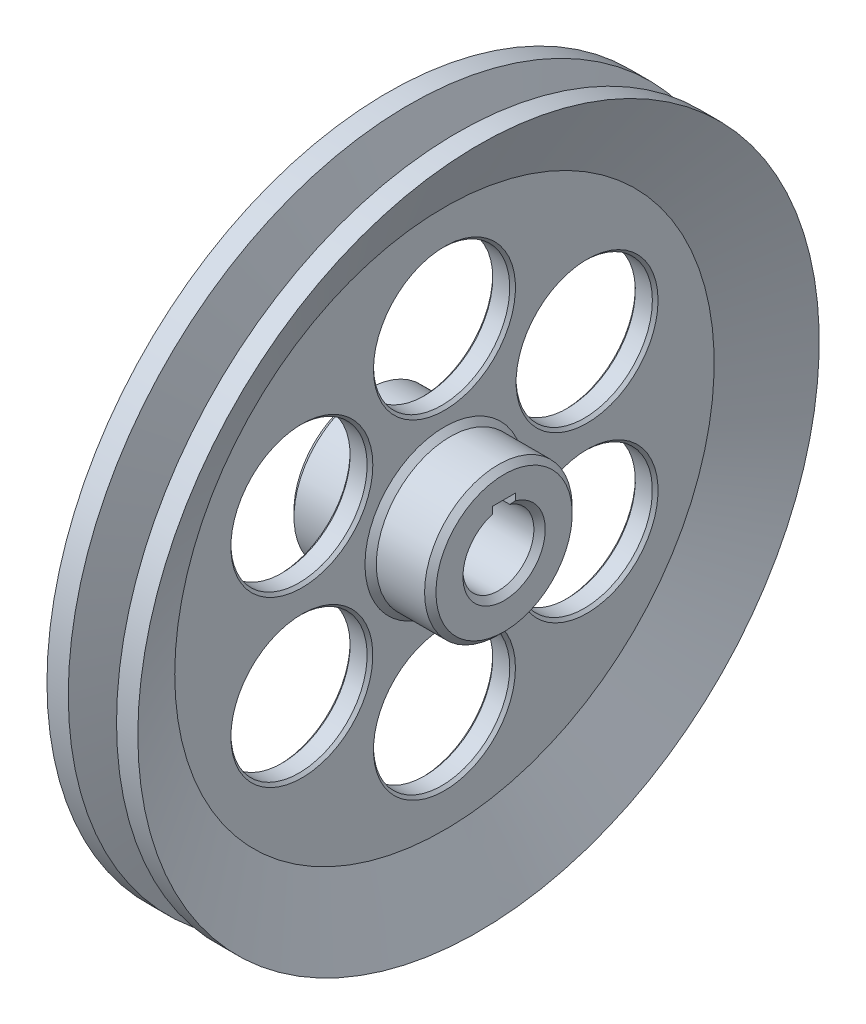
ISO-10303-21;
HEADER;
FILE_DESCRIPTION(('STEP AP214'),'2;1');
FILE_NAME('part.step','',(''),(''),'','','');
FILE_SCHEMA(('AUTOMOTIVE_DESIGN { 1 0 10303 214 1 1 1 1 }'));
ENDSEC;
DATA;
#1=APPLICATION_CONTEXT('core data for automotive mechanical design processes');
#2=APPLICATION_PROTOCOL_DEFINITION('international standard','automotive_design',2000,#1);
#3=PRODUCT_CONTEXT('',#1,'mechanical');
#4=PRODUCT('Part','Part','',(#3));
#5=PRODUCT_RELATED_PRODUCT_CATEGORY('part','',(#4));
#6=PRODUCT_DEFINITION_FORMATION('','',#4);
#7=PRODUCT_DEFINITION_CONTEXT('part definition',#1,'design');
#8=PRODUCT_DEFINITION('design','',#6,#7);
#9=PRODUCT_DEFINITION_SHAPE('','',#8);
#10=(LENGTH_UNIT() NAMED_UNIT(*) SI_UNIT(.MILLI.,.METRE.));
#11=(NAMED_UNIT(*) PLANE_ANGLE_UNIT() SI_UNIT($,.RADIAN.));
#12=(NAMED_UNIT(*) SI_UNIT($,.STERADIAN.) SOLID_ANGLE_UNIT());
#13=UNCERTAINTY_MEASURE_WITH_UNIT(LENGTH_MEASURE(1.E-05),#10,'distance_accuracy_value','');
#14=(GEOMETRIC_REPRESENTATION_CONTEXT(3) GLOBAL_UNCERTAINTY_ASSIGNED_CONTEXT((#13)) GLOBAL_UNIT_ASSIGNED_CONTEXT((#10,
#11,#12)) REPRESENTATION_CONTEXT('',''));
#15=CARTESIAN_POINT('',(0.,0.,0.));
#16=DIRECTION('',(0.,0.,1.));
#17=DIRECTION('',(1.,0.,0.));
#18=AXIS2_PLACEMENT_3D('',#15,#16,#17);
#19=CARTESIAN_POINT('',(-25.,26.,0.));
#20=DIRECTION('',(1.,0.,0.));
#21=DIRECTION('',(0.,0.,-1.));
#22=AXIS2_PLACEMENT_3D('',#19,#20,#21);
#23=PLANE('',#22);
#24=CARTESIAN_POINT('',(-25.,0.,0.));
#25=DIRECTION('',(1.,0.,0.));
#26=DIRECTION('',(0.,0.,-1.));
#27=AXIS2_PLACEMENT_3D('',#24,#25,#26);
#28=CIRCLE('',#27,24.);
#29=CARTESIAN_POINT('',(-25.,0.,-24.));
#30=VERTEX_POINT('',#29);
#31=EDGE_CURVE('E251',#30,#30,#28,.F.);
#32=ORIENTED_EDGE('',*,*,#31,.T.);
#33=EDGE_LOOP('',(#32));
#34=FACE_BOUND('',#33,.T.);
#35=DIRECTION('',(0.,-1.,0.));
#36=VECTOR('',#35,1.);
#37=CARTESIAN_POINT('',(-25.,0.,4.00000000000001));
#38=LINE('',#37,#36);
#39=CARTESIAN_POINT('',(-25.,16.3,4.));
#40=VERTEX_POINT('',#39);
#41=CARTESIAN_POINT('',(-25.,13.9373598647664,4.));
#42=VERTEX_POINT('',#41);
#43=EDGE_CURVE('E104',#40,#42,#38,.T.);
#44=ORIENTED_EDGE('',*,*,#43,.T.);
#45=CARTESIAN_POINT('',(-25.,0.,0.));
#46=DIRECTION('',(1.,0.,0.));
#47=DIRECTION('',(0.,0.,-1.));
#48=AXIS2_PLACEMENT_3D('',#45,#46,#47);
#49=CIRCLE('',#48,14.5000000000001);
#50=CARTESIAN_POINT('',(-25.,13.9373598647664,-4.));
#51=VERTEX_POINT('',#50);
#52=EDGE_CURVE('E56',#42,#51,#49,.T.);
#53=ORIENTED_EDGE('',*,*,#52,.T.);
#54=DIRECTION('',(0.,1.,0.));
#55=VECTOR('',#54,1.);
#56=CARTESIAN_POINT('',(-25.,0.,-4.00000000000001));
#57=LINE('',#56,#55);
#58=CARTESIAN_POINT('',(-25.,16.3,-4.));
#59=VERTEX_POINT('',#58);
#60=EDGE_CURVE('E110',#51,#59,#57,.T.);
#61=ORIENTED_EDGE('',*,*,#60,.T.);
#62=DIRECTION('',(0.,0.,1.));
#63=VECTOR('',#62,1.);
#64=CARTESIAN_POINT('',(-25.,16.3,0.));
#65=LINE('',#64,#63);
#66=EDGE_CURVE('E102',#59,#40,#65,.T.);
#67=ORIENTED_EDGE('',*,*,#66,.T.);
#68=EDGE_LOOP('',(#44,#53,#61,#67));
#69=FACE_BOUND('',#68,.T.);
#70=ADVANCED_FACE('F33',(#34,#69),#23,.F.);
#71=CARTESIAN_POINT('',(25.,26.,0.));
#72=DIRECTION('',(-1.,0.,0.));
#73=DIRECTION('',(0.,0.,1.));
#74=AXIS2_PLACEMENT_3D('',#71,#72,#73);
#75=PLANE('',#74);
#76=CARTESIAN_POINT('',(25.,0.,0.));
#77=DIRECTION('',(-1.,0.,0.));
#78=DIRECTION('',(0.,0.,1.));
#79=AXIS2_PLACEMENT_3D('',#76,#77,#78);
#80=CIRCLE('',#79,23.9999999999999);
#81=CARTESIAN_POINT('',(25.,0.,23.9999999999999));
#82=VERTEX_POINT('',#81);
#83=EDGE_CURVE('E279',#82,#82,#80,.F.);
#84=ORIENTED_EDGE('',*,*,#83,.T.);
#85=EDGE_LOOP('',(#84));
#86=FACE_BOUND('',#85,.T.);
#87=DIRECTION('',(0.,-1.,0.));
#88=VECTOR('',#87,1.);
#89=CARTESIAN_POINT('',(25.,0.,-4.00000000000001));
#90=LINE('',#89,#88);
#91=CARTESIAN_POINT('',(25.,16.3,-4.));
#92=VERTEX_POINT('',#91);
#93=CARTESIAN_POINT('',(25.,13.9373598647664,-4.));
#94=VERTEX_POINT('',#93);
#95=EDGE_CURVE('E85',#92,#94,#90,.T.);
#96=ORIENTED_EDGE('',*,*,#95,.T.);
#97=CARTESIAN_POINT('',(25.,0.,0.));
#98=DIRECTION('',(-1.,0.,0.));
#99=DIRECTION('',(0.,0.,1.));
#100=AXIS2_PLACEMENT_3D('',#97,#98,#99);
#101=CIRCLE('',#100,14.5000000000001);
#102=CARTESIAN_POINT('',(25.,13.9373598647664,4.));
#103=VERTEX_POINT('',#102);
#104=EDGE_CURVE('E261',#94,#103,#101,.T.);
#105=ORIENTED_EDGE('',*,*,#104,.T.);
#106=DIRECTION('',(0.,1.,0.));
#107=VECTOR('',#106,1.);
#108=CARTESIAN_POINT('',(25.,0.,4.00000000000001));
#109=LINE('',#108,#107);
#110=CARTESIAN_POINT('',(25.,16.3,4.));
#111=VERTEX_POINT('',#110);
#112=EDGE_CURVE('E108',#103,#111,#109,.T.);
#113=ORIENTED_EDGE('',*,*,#112,.T.);
#114=DIRECTION('',(0.,0.,-1.));
#115=VECTOR('',#114,1.);
#116=CARTESIAN_POINT('',(25.,16.3,0.));
#117=LINE('',#116,#115);
#118=EDGE_CURVE('E99',#111,#92,#117,.T.);
#119=ORIENTED_EDGE('',*,*,#118,.T.);
#120=EDGE_LOOP('',(#96,#105,#113,#119));
#121=FACE_BOUND('',#120,.T.);
#122=ADVANCED_FACE('F106',(#86,#121),#75,.F.);
#123=CARTESIAN_POINT('',(-76.2016634348991,0.,0.));
#124=DIRECTION('',(-1.,0.,0.));
#125=DIRECTION('',(0.,0.,1.));
#126=AXIS2_PLACEMENT_3D('',#123,#124,#125);
#127=CYLINDRICAL_SURFACE('',#126,26.);
#128=CARTESIAN_POINT('',(23.,0.,0.));
#129=DIRECTION('',(-1.,0.,0.));
#130=DIRECTION('',(0.,0.,1.));
#131=AXIS2_PLACEMENT_3D('',#128,#129,#130);
#132=CIRCLE('',#131,26.);
#133=CARTESIAN_POINT('',(23.,0.,26.));
#134=VERTEX_POINT('',#133);
#135=EDGE_CURVE('E276',#134,#134,#132,.T.);
#136=ORIENTED_EDGE('',*,*,#135,.T.);
#137=EDGE_LOOP('',(#136));
#138=FACE_BOUND('',#137,.T.);
#139=CARTESIAN_POINT('',(5.99999999999996,0.,0.));
#140=DIRECTION('',(-1.,0.,0.));
#141=DIRECTION('',(0.,0.,1.));
#142=AXIS2_PLACEMENT_3D('',#139,#140,#141);
#143=CIRCLE('',#142,26.);
#144=CARTESIAN_POINT('',(5.99999999999996,0.,26.));
#145=VERTEX_POINT('',#144);
#146=EDGE_CURVE('E273',#145,#145,#143,.F.);
#147=ORIENTED_EDGE('',*,*,#146,.T.);
#148=EDGE_LOOP('',(#147));
#149=FACE_BOUND('',#148,.T.);
#150=ADVANCED_FACE('F238',(#138,#149),#127,.T.);
#151=CARTESIAN_POINT('',(4.,95.,0.));
#152=DIRECTION('',(-1.,0.,0.));
#153=DIRECTION('',(0.,0.,1.));
#154=AXIS2_PLACEMENT_3D('',#151,#152,#153);
#155=PLANE('',#154);
#156=CARTESIAN_POINT('',(4.,29.0000000000006,-50.2294734194971));
#157=DIRECTION('',(-1.,0.,0.));
#158=DIRECTION('',(0.,0.866025403784433,0.50000000000001));
#159=AXIS2_PLACEMENT_3D('',#156,#157,#158);
#160=CIRCLE('',#159,25.0000000000001);
#161=CARTESIAN_POINT('',(4.,50.6506350946115,-37.7294734194968));
#162=VERTEX_POINT('',#161);
#163=EDGE_CURVE('E634',#162,#162,#160,.T.);
#164=ORIENTED_EDGE('',*,*,#163,.T.);
#165=EDGE_LOOP('',(#164));
#166=FACE_BOUND('',#165,.T.);
#167=CARTESIAN_POINT('',(4.,-28.9999999999995,-50.2294734194977));
#168=DIRECTION('',(-1.,0.,0.));
#169=DIRECTION('',(0.,0.866025403784443,-0.499999999999992));
#170=AXIS2_PLACEMENT_3D('',#167,#168,#169);
#171=CIRCLE('',#170,25.0000000000001);
#172=CARTESIAN_POINT('',(4.,-7.34936490538838,-62.7294734194976));
#173=VERTEX_POINT('',#172);
#174=EDGE_CURVE('E643',#173,#173,#171,.T.);
#175=ORIENTED_EDGE('',*,*,#174,.T.);
#176=EDGE_LOOP('',(#175));
#177=FACE_BOUND('',#176,.T.);
#178=CARTESIAN_POINT('',(4.,-58.,0.));
#179=DIRECTION('',(-1.,0.,0.));
#180=DIRECTION('',(0.,0.,-1.));
#181=AXIS2_PLACEMENT_3D('',#178,#179,#180);
#182=CIRCLE('',#181,25.0000000000001);
#183=CARTESIAN_POINT('',(4.,-58.,-25.0000000000001));
#184=VERTEX_POINT('',#183);
#185=EDGE_CURVE('E660',#184,#184,#182,.T.);
#186=ORIENTED_EDGE('',*,*,#185,.T.);
#187=EDGE_LOOP('',(#186));
#188=FACE_BOUND('',#187,.T.);
#189=CARTESIAN_POINT('',(4.,-29.0000000000002,50.2294734194973));
#190=DIRECTION('',(-1.,0.,0.));
#191=DIRECTION('',(0.,-0.866025403784436,-0.500000000000004));
#192=AXIS2_PLACEMENT_3D('',#189,#190,#191);
#193=CIRCLE('',#192,25.0000000000001);
#194=CARTESIAN_POINT('',(4.,-50.6506350946112,37.7294734194972));
#195=VERTEX_POINT('',#194);
#196=EDGE_CURVE('E672',#195,#195,#193,.T.);
#197=ORIENTED_EDGE('',*,*,#196,.T.);
#198=EDGE_LOOP('',(#197));
#199=FACE_BOUND('',#198,.T.);
#200=CARTESIAN_POINT('',(4.,28.9999999999999,50.2294734194975));
#201=DIRECTION('',(-1.,0.,0.));
#202=DIRECTION('',(0.,-0.86602540378444,0.499999999999998));
#203=AXIS2_PLACEMENT_3D('',#200,#201,#202);
#204=CIRCLE('',#203,25.0000000000001);
#205=CARTESIAN_POINT('',(4.,7.34936490538882,62.7294734194975));
#206=VERTEX_POINT('',#205);
#207=EDGE_CURVE('E684',#206,#206,#204,.T.);
#208=ORIENTED_EDGE('',*,*,#207,.T.);
#209=EDGE_LOOP('',(#208));
#210=FACE_BOUND('',#209,.T.);
#211=CARTESIAN_POINT('',(4.,58.,0.));
#212=DIRECTION('',(-1.,0.,0.));
#213=DIRECTION('',(0.,0.,1.));
#214=AXIS2_PLACEMENT_3D('',#211,#212,#213);
#215=CIRCLE('',#214,25.0000000000001);
#216=CARTESIAN_POINT('',(4.,58.,25.0000000000001));
#217=VERTEX_POINT('',#216);
#218=EDGE_CURVE('E11',#217,#217,#215,.T.);
#219=ORIENTED_EDGE('',*,*,#218,.T.);
#220=EDGE_LOOP('',(#219));
#221=FACE_BOUND('',#220,.T.);
#222=CARTESIAN_POINT('',(4.,0.,0.));
#223=DIRECTION('',(-1.,0.,0.));
#224=DIRECTION('',(0.,0.,1.));
#225=AXIS2_PLACEMENT_3D('',#222,#223,#224);
#226=CIRCLE('',#225,28.);
#227=CARTESIAN_POINT('',(4.,0.,28.));
#228=VERTEX_POINT('',#227);
#229=EDGE_CURVE('E282',#228,#228,#226,.T.);
#230=ORIENTED_EDGE('',*,*,#229,.T.);
#231=EDGE_LOOP('',(#230));
#232=FACE_BOUND('',#231,.T.);
#233=CARTESIAN_POINT('',(4.,0.,0.));
#234=DIRECTION('',(-1.,0.,0.));
#235=DIRECTION('',(0.,0.,1.));
#236=AXIS2_PLACEMENT_3D('',#233,#234,#235);
#237=CIRCLE('',#236,95.);
#238=CARTESIAN_POINT('',(4.,0.,95.));
#239=VERTEX_POINT('',#238);
#240=EDGE_CURVE('E144',#239,#239,#237,.T.);
#241=ORIENTED_EDGE('',*,*,#240,.F.);
#242=EDGE_LOOP('',(#241));
#243=FACE_BOUND('',#242,.T.);
#244=ADVANCED_FACE('F234',(#166,#177,#188,#199,#210,#221,#232,#243),#155,.F.);
#245=CARTESIAN_POINT('',(4.,0.,0.));
#246=DIRECTION('',(1.,0.,0.));
#247=DIRECTION('',(0.,0.,-1.));
#248=AXIS2_PLACEMENT_3D('',#245,#246,#247);
#249=CONICAL_SURFACE('',#248,95.,1.12327635163773);
#250=CARTESIAN_POINT('',(16.,0.,0.));
#251=DIRECTION('',(-1.,0.,0.));
#252=DIRECTION('',(0.,0.,1.));
#253=AXIS2_PLACEMENT_3D('',#250,#251,#252);
#254=CIRCLE('',#253,120.);
#255=CARTESIAN_POINT('',(16.,0.,120.));
#256=VERTEX_POINT('',#255);
#257=EDGE_CURVE('E141',#256,#256,#254,.T.);
#258=ORIENTED_EDGE('',*,*,#257,.F.);
#259=EDGE_LOOP('',(#258));
#260=FACE_BOUND('',#259,.T.);
#261=ORIENTED_EDGE('',*,*,#240,.T.);
#262=EDGE_LOOP('',(#261));
#263=FACE_BOUND('',#262,.T.);
#264=ADVANCED_FACE('F230',(#260,#263),#249,.F.);
#265=CARTESIAN_POINT('',(-76.2016634348991,0.,0.));
#266=DIRECTION('',(-1.,0.,0.));
#267=DIRECTION('',(0.,0.,1.));
#268=AXIS2_PLACEMENT_3D('',#265,#266,#267);
#269=CYLINDRICAL_SURFACE('',#268,120.);
#270=CARTESIAN_POINT('',(8.50000000000001,0.,0.));
#271=DIRECTION('',(-1.,0.,0.));
#272=DIRECTION('',(0.,0.,1.));
#273=AXIS2_PLACEMENT_3D('',#270,#271,#272);
#274=CIRCLE('',#273,120.);
#275=CARTESIAN_POINT('',(8.50000000000001,0.,120.));
#276=VERTEX_POINT('',#275);
#277=EDGE_CURVE('E138',#276,#276,#274,.T.);
#278=ORIENTED_EDGE('',*,*,#277,.F.);
#279=EDGE_LOOP('',(#278));
#280=FACE_BOUND('',#279,.T.);
#281=ORIENTED_EDGE('',*,*,#257,.T.);
#282=EDGE_LOOP('',(#281));
#283=FACE_BOUND('',#282,.T.);
#284=ADVANCED_FACE('F226',(#280,#283),#269,.T.);
#285=CARTESIAN_POINT('',(8.50000000000001,0.,0.));
#286=DIRECTION('',(1.,0.,0.));
#287=DIRECTION('',(0.,0.,-1.));
#288=AXIS2_PLACEMENT_3D('',#285,#286,#287);
#289=CONICAL_SURFACE('',#288,120.,1.22173047639603);
#290=CARTESIAN_POINT('',(2.67647625174082,0.,0.));
#291=DIRECTION('',(-1.,0.,0.));
#292=DIRECTION('',(0.,0.,1.));
#293=AXIS2_PLACEMENT_3D('',#290,#291,#292);
#294=CIRCLE('',#293,104.);
#295=CARTESIAN_POINT('',(2.67647625174082,0.,104.));
#296=VERTEX_POINT('',#295);
#297=EDGE_CURVE('E135',#296,#296,#294,.T.);
#298=ORIENTED_EDGE('',*,*,#297,.F.);
#299=EDGE_LOOP('',(#298));
#300=FACE_BOUND('',#299,.T.);
#301=ORIENTED_EDGE('',*,*,#277,.T.);
#302=EDGE_LOOP('',(#301));
#303=FACE_BOUND('',#302,.T.);
#304=ADVANCED_FACE('F222',(#300,#303),#289,.T.);
#305=CARTESIAN_POINT('',(-76.2016634348991,0.,0.));
#306=DIRECTION('',(-1.,0.,0.));
#307=DIRECTION('',(0.,0.,1.));
#308=AXIS2_PLACEMENT_3D('',#305,#306,#307);
#309=CYLINDRICAL_SURFACE('',#308,104.);
#310=CARTESIAN_POINT('',(-2.67647625174082,0.,0.));
#311=DIRECTION('',(-1.,0.,0.));
#312=DIRECTION('',(0.,0.,1.));
#313=AXIS2_PLACEMENT_3D('',#310,#311,#312);
#314=CIRCLE('',#313,104.);
#315=CARTESIAN_POINT('',(-2.67647625174082,0.,104.));
#316=VERTEX_POINT('',#315);
#317=EDGE_CURVE('E132',#316,#316,#314,.T.);
#318=ORIENTED_EDGE('',*,*,#317,.F.);
#319=EDGE_LOOP('',(#318));
#320=FACE_BOUND('',#319,.T.);
#321=ORIENTED_EDGE('',*,*,#297,.T.);
#322=EDGE_LOOP('',(#321));
#323=FACE_BOUND('',#322,.T.);
#324=ADVANCED_FACE('F218',(#320,#323),#309,.T.);
#325=CARTESIAN_POINT('',(-2.67647625174082,0.,0.));
#326=DIRECTION('',(-1.,0.,0.));
#327=DIRECTION('',(0.,0.,1.));
#328=AXIS2_PLACEMENT_3D('',#325,#326,#327);
#329=CONICAL_SURFACE('',#328,104.,1.22173047639603);
#330=CARTESIAN_POINT('',(-8.50000000000001,0.,0.));
#331=DIRECTION('',(-1.,0.,0.));
#332=DIRECTION('',(0.,0.,1.));
#333=AXIS2_PLACEMENT_3D('',#330,#331,#332);
#334=CIRCLE('',#333,120.);
#335=CARTESIAN_POINT('',(-8.50000000000001,0.,120.));
#336=VERTEX_POINT('',#335);
#337=EDGE_CURVE('E129',#336,#336,#334,.T.);
#338=ORIENTED_EDGE('',*,*,#337,.F.);
#339=EDGE_LOOP('',(#338));
#340=FACE_BOUND('',#339,.T.);
#341=ORIENTED_EDGE('',*,*,#317,.T.);
#342=EDGE_LOOP('',(#341));
#343=FACE_BOUND('',#342,.T.);
#344=ADVANCED_FACE('F214',(#340,#343),#329,.T.);
#345=CARTESIAN_POINT('',(-76.2016634348991,0.,0.));
#346=DIRECTION('',(-1.,0.,0.));
#347=DIRECTION('',(0.,0.,1.));
#348=AXIS2_PLACEMENT_3D('',#345,#346,#347);
#349=CYLINDRICAL_SURFACE('',#348,120.);
#350=CARTESIAN_POINT('',(-16.,0.,0.));
#351=DIRECTION('',(-1.,0.,0.));
#352=DIRECTION('',(0.,0.,1.));
#353=AXIS2_PLACEMENT_3D('',#350,#351,#352);
#354=CIRCLE('',#353,120.);
#355=CARTESIAN_POINT('',(-16.,0.,120.));
#356=VERTEX_POINT('',#355);
#357=EDGE_CURVE('E126',#356,#356,#354,.T.);
#358=ORIENTED_EDGE('',*,*,#357,.F.);
#359=EDGE_LOOP('',(#358));
#360=FACE_BOUND('',#359,.T.);
#361=ORIENTED_EDGE('',*,*,#337,.T.);
#362=EDGE_LOOP('',(#361));
#363=FACE_BOUND('',#362,.T.);
#364=ADVANCED_FACE('F210',(#360,#363),#349,.T.);
#365=CARTESIAN_POINT('',(-16.,0.,0.));
#366=DIRECTION('',(-1.,0.,0.));
#367=DIRECTION('',(0.,0.,1.));
#368=AXIS2_PLACEMENT_3D('',#365,#366,#367);
#369=CONICAL_SURFACE('',#368,120.,1.12327635163773);
#370=CARTESIAN_POINT('',(-4.,0.,0.));
#371=DIRECTION('',(-1.,0.,0.));
#372=DIRECTION('',(0.,0.,1.));
#373=AXIS2_PLACEMENT_3D('',#370,#371,#372);
#374=CIRCLE('',#373,95.);
#375=CARTESIAN_POINT('',(-4.,0.,95.));
#376=VERTEX_POINT('',#375);
#377=EDGE_CURVE('E92',#376,#376,#374,.T.);
#378=ORIENTED_EDGE('',*,*,#377,.F.);
#379=EDGE_LOOP('',(#378));
#380=FACE_BOUND('',#379,.T.);
#381=ORIENTED_EDGE('',*,*,#357,.T.);
#382=EDGE_LOOP('',(#381));
#383=FACE_BOUND('',#382,.T.);
#384=ADVANCED_FACE('F206',(#380,#383),#369,.F.);
#385=CARTESIAN_POINT('',(-4.,95.,0.));
#386=DIRECTION('',(1.,0.,0.));
#387=DIRECTION('',(0.,0.,-1.));
#388=AXIS2_PLACEMENT_3D('',#385,#386,#387);
#389=PLANE('',#388);
#390=CARTESIAN_POINT('',(-4.,29.0000000000006,-50.2294734194971));
#391=DIRECTION('',(1.,0.,0.));
#392=DIRECTION('',(0.,-0.866025403784433,-0.50000000000001));
#393=AXIS2_PLACEMENT_3D('',#390,#391,#392);
#394=CIRCLE('',#393,25.0000000000001);
#395=CARTESIAN_POINT('',(-4.,7.3493649053897,-62.7294734194974));
#396=VERTEX_POINT('',#395);
#397=EDGE_CURVE('E640',#396,#396,#394,.T.);
#398=ORIENTED_EDGE('',*,*,#397,.T.);
#399=EDGE_LOOP('',(#398));
#400=FACE_BOUND('',#399,.T.);
#401=CARTESIAN_POINT('',(-4.,-28.9999999999995,-50.2294734194977));
#402=DIRECTION('',(1.,0.,0.));
#403=DIRECTION('',(0.,-0.866025403784443,0.499999999999992));
#404=AXIS2_PLACEMENT_3D('',#401,#402,#403);
#405=CIRCLE('',#404,25.0000000000001);
#406=CARTESIAN_POINT('',(-4.,-50.6506350946107,-37.7294734194979));
#407=VERTEX_POINT('',#406);
#408=EDGE_CURVE('E651',#407,#407,#405,.T.);
#409=ORIENTED_EDGE('',*,*,#408,.T.);
#410=EDGE_LOOP('',(#409));
#411=FACE_BOUND('',#410,.T.);
#412=CARTESIAN_POINT('',(-4.,-58.,0.));
#413=DIRECTION('',(1.,0.,0.));
#414=DIRECTION('',(0.,0.,1.));
#415=AXIS2_PLACEMENT_3D('',#412,#413,#414);
#416=CIRCLE('',#415,25.0000000000001);
#417=CARTESIAN_POINT('',(-4.,-58.,25.0000000000001));
#418=VERTEX_POINT('',#417);
#419=EDGE_CURVE('E663',#418,#418,#416,.T.);
#420=ORIENTED_EDGE('',*,*,#419,.T.);
#421=EDGE_LOOP('',(#420));
#422=FACE_BOUND('',#421,.T.);
#423=CARTESIAN_POINT('',(-4.,-29.0000000000002,50.2294734194973));
#424=DIRECTION('',(1.,0.,0.));
#425=DIRECTION('',(0.,0.866025403784436,0.500000000000004));
#426=AXIS2_PLACEMENT_3D('',#423,#424,#425);
#427=CIRCLE('',#426,25.0000000000001);
#428=CARTESIAN_POINT('',(-4.,-7.34936490538926,62.7294734194975));
#429=VERTEX_POINT('',#428);
#430=EDGE_CURVE('E675',#429,#429,#427,.T.);
#431=ORIENTED_EDGE('',*,*,#430,.T.);
#432=EDGE_LOOP('',(#431));
#433=FACE_BOUND('',#432,.T.);
#434=CARTESIAN_POINT('',(-4.,28.9999999999999,50.2294734194975));
#435=DIRECTION('',(1.,0.,0.));
#436=DIRECTION('',(0.,0.86602540378444,-0.499999999999998));
#437=AXIS2_PLACEMENT_3D('',#434,#435,#436);
#438=CIRCLE('',#437,25.0000000000001);
#439=CARTESIAN_POINT('',(-4.,50.6506350946109,37.7294734194975));
#440=VERTEX_POINT('',#439);
#441=EDGE_CURVE('E687',#440,#440,#438,.T.);
#442=ORIENTED_EDGE('',*,*,#441,.T.);
#443=EDGE_LOOP('',(#442));
#444=FACE_BOUND('',#443,.T.);
#445=CARTESIAN_POINT('',(-4.,58.,0.));
#446=DIRECTION('',(1.,0.,0.));
#447=DIRECTION('',(0.,0.,-1.));
#448=AXIS2_PLACEMENT_3D('',#445,#446,#447);
#449=CIRCLE('',#448,25.0000000000001);
#450=CARTESIAN_POINT('',(-4.,58.,-25.0000000000001));
#451=VERTEX_POINT('',#450);
#452=EDGE_CURVE('E41',#451,#451,#449,.T.);
#453=ORIENTED_EDGE('',*,*,#452,.T.);
#454=EDGE_LOOP('',(#453));
#455=FACE_BOUND('',#454,.T.);
#456=CARTESIAN_POINT('',(-4.,0.,0.));
#457=DIRECTION('',(1.,0.,0.));
#458=DIRECTION('',(0.,0.,-1.));
#459=AXIS2_PLACEMENT_3D('',#456,#457,#458);
#460=CIRCLE('',#459,27.9999999999999);
#461=CARTESIAN_POINT('',(-4.,0.,-27.9999999999999));
#462=VERTEX_POINT('',#461);
#463=EDGE_CURVE('E270',#462,#462,#460,.T.);
#464=ORIENTED_EDGE('',*,*,#463,.T.);
#465=EDGE_LOOP('',(#464));
#466=FACE_BOUND('',#465,.T.);
#467=ORIENTED_EDGE('',*,*,#377,.T.);
#468=EDGE_LOOP('',(#467));
#469=FACE_BOUND('',#468,.T.);
#470=ADVANCED_FACE('F202',(#400,#411,#422,#433,#444,#455,#466,#469),#389,.F.);
#471=CARTESIAN_POINT('',(-76.2016634348991,0.,0.));
#472=DIRECTION('',(-1.,0.,0.));
#473=DIRECTION('',(0.,0.,1.));
#474=AXIS2_PLACEMENT_3D('',#471,#472,#473);
#475=CYLINDRICAL_SURFACE('',#474,26.);
#476=CARTESIAN_POINT('',(-23.,0.,0.));
#477=DIRECTION('',(1.,0.,0.));
#478=DIRECTION('',(0.,0.,-1.));
#479=AXIS2_PLACEMENT_3D('',#476,#477,#478);
#480=CIRCLE('',#479,26.);
#481=CARTESIAN_POINT('',(-23.,0.,-26.));
#482=VERTEX_POINT('',#481);
#483=EDGE_CURVE('E267',#482,#482,#480,.T.);
#484=ORIENTED_EDGE('',*,*,#483,.T.);
#485=EDGE_LOOP('',(#484));
#486=FACE_BOUND('',#485,.T.);
#487=CARTESIAN_POINT('',(-5.99999999999995,0.,0.));
#488=DIRECTION('',(1.,0.,0.));
#489=DIRECTION('',(0.,0.,-1.));
#490=AXIS2_PLACEMENT_3D('',#487,#488,#489);
#491=CIRCLE('',#490,26.);
#492=CARTESIAN_POINT('',(-5.99999999999995,0.,-26.));
#493=VERTEX_POINT('',#492);
#494=EDGE_CURVE('E262',#493,#493,#491,.F.);
#495=ORIENTED_EDGE('',*,*,#494,.T.);
#496=EDGE_LOOP('',(#495));
#497=FACE_BOUND('',#496,.T.);
#498=ADVANCED_FACE('F199',(#486,#497),#475,.T.);
#499=CARTESIAN_POINT('',(25.001,16.3,0.));
#500=DIRECTION('',(0.,-1.,0.));
#501=DIRECTION('',(0.,0.,-1.));
#502=AXIS2_PLACEMENT_3D('',#499,#500,#501);
#503=PLANE('',#502);
#504=DIRECTION('',(-1.,0.,0.));
#505=VECTOR('',#504,1.);
#506=CARTESIAN_POINT('',(25.001,16.3,4.));
#507=LINE('',#506,#505);
#508=EDGE_CURVE('E93',#111,#40,#507,.T.);
#509=ORIENTED_EDGE('',*,*,#508,.T.);
#510=ORIENTED_EDGE('',*,*,#66,.F.);
#511=DIRECTION('',(-1.,0.,0.));
#512=VECTOR('',#511,1.);
#513=CARTESIAN_POINT('',(25.001,16.3,-4.));
#514=LINE('',#513,#512);
#515=EDGE_CURVE('E88',#92,#59,#514,.T.);
#516=ORIENTED_EDGE('',*,*,#515,.F.);
#517=ORIENTED_EDGE('',*,*,#118,.F.);
#518=EDGE_LOOP('',(#509,#510,#516,#517));
#519=FACE_BOUND('',#518,.T.);
#520=ADVANCED_FACE('F98',(#519),#503,.T.);
#521=CARTESIAN_POINT('',(25.001,0.,4.00000000000001));
#522=DIRECTION('',(0.,0.,-1.));
#523=DIRECTION('',(0.,1.,0.));
#524=AXIS2_PLACEMENT_3D('',#521,#522,#523);
#525=PLANE('',#524);
#526=DIRECTION('',(-1.,0.,0.));
#527=VECTOR('',#526,1.);
#528=CARTESIAN_POINT('',(25.001,11.842719282327,4.));
#529=LINE('',#528,#527);
#530=CARTESIAN_POINT('',(22.9999999999999,11.842719282327,4.));
#531=VERTEX_POINT('',#530);
#532=CARTESIAN_POINT('',(-22.9999999999999,11.842719282327,4.));
#533=VERTEX_POINT('',#532);
#534=EDGE_CURVE('E119',#531,#533,#529,.T.);
#535=ORIENTED_EDGE('',*,*,#534,.T.);
#536=CARTESIAN_POINT('',(-22.9999999999999,11.842719282327,4.));
#537=CARTESIAN_POINT('',(-23.165989114399,12.0179185662062,4.));
#538=CARTESIAN_POINT('',(-23.3321745203292,12.1929317065842,4.));
#539=CARTESIAN_POINT('',(-23.6648960539984,12.5426232386276,4.));
#540=CARTESIAN_POINT('',(-23.8314321806061,12.7173016313692,4.));
#541=CARTESIAN_POINT('',(-24.1648142536474,13.0663622188084,4.));
#542=CARTESIAN_POINT('',(-24.3316601998756,13.240744413702,4.));
#543=CARTESIAN_POINT('',(-24.665629971065,13.5892436018864,4.));
#544=CARTESIAN_POINT('',(-24.8327537969185,13.7633605943219,4.));
#545=CARTESIAN_POINT('',(-25.,13.9373598647664,4.));
#546=B_SPLINE_CURVE_WITH_KNOTS('',3,(#536,#537,#538,#539,#540,#541,#542,#543,#544,#545),
.UNSPECIFIED.,.F.,.F.,(4,2,2,2,4),(0.,0.724033216426758,1.44806410106892,2.17209450612427,
2.89612724097536),.UNSPECIFIED.);
#547=EDGE_CURVE('E160',#533,#42,#546,.T.);
#548=ORIENTED_EDGE('',*,*,#547,.T.);
#549=ORIENTED_EDGE('',*,*,#43,.F.);
#550=ORIENTED_EDGE('',*,*,#508,.F.);
#551=ORIENTED_EDGE('',*,*,#112,.F.);
#552=CARTESIAN_POINT('',(25.,13.9373598647664,4.));
#553=CARTESIAN_POINT('',(24.8327537969185,13.7633605943219,4.));
#554=CARTESIAN_POINT('',(24.665629971065,13.5892436018864,4.));
#555=CARTESIAN_POINT('',(24.3316601998756,13.240744413702,4.));
#556=CARTESIAN_POINT('',(24.1648142536474,13.0663622188084,4.));
#557=CARTESIAN_POINT('',(23.8314321806061,12.7173016313692,4.));
#558=CARTESIAN_POINT('',(23.6648960539984,12.5426232386276,4.));
#559=CARTESIAN_POINT('',(23.3321745203292,12.1929317065842,4.));
#560=CARTESIAN_POINT('',(23.165989114399,12.0179185662062,4.));
#561=CARTESIAN_POINT('',(22.9999999999999,11.842719282327,4.));
#562=B_SPLINE_CURVE_WITH_KNOTS('',3,(#552,#553,#554,#555,#556,#557,#558,#559,#560,#561),
.UNSPECIFIED.,.F.,.F.,(4,2,2,2,4),(0.,0.724032734851082,1.44806313990644,2.1720940245486,
2.89612724097536),.UNSPECIFIED.);
#563=EDGE_CURVE('E153',#103,#531,#562,.T.);
#564=ORIENTED_EDGE('',*,*,#563,.T.);
#565=EDGE_LOOP('',(#535,#548,#549,#550,#551,#564));
#566=FACE_BOUND('',#565,.T.);
#567=ADVANCED_FACE('F166',(#566),#525,.T.);
#568=CARTESIAN_POINT('',(25.001,0.,0.));
#569=DIRECTION('',(-1.,0.,0.));
#570=DIRECTION('',(0.,0.,1.));
#571=AXIS2_PLACEMENT_3D('',#568,#569,#570);
#572=CYLINDRICAL_SURFACE('',#571,12.5);
#573=DIRECTION('',(-1.,0.,0.));
#574=VECTOR('',#573,1.);
#575=CARTESIAN_POINT('',(25.001,11.842719282327,-4.));
#576=LINE('',#575,#574);
#577=CARTESIAN_POINT('',(22.9999999999999,11.842719282327,-4.));
#578=VERTEX_POINT('',#577);
#579=CARTESIAN_POINT('',(-22.9999999999999,11.842719282327,-4.));
#580=VERTEX_POINT('',#579);
#581=EDGE_CURVE('E103',#578,#580,#576,.T.);
#582=ORIENTED_EDGE('',*,*,#581,.T.);
#583=CARTESIAN_POINT('',(-22.9999999999999,0.,0.));
#584=DIRECTION('',(1.,0.,0.));
#585=DIRECTION('',(0.,0.,-1.));
#586=AXIS2_PLACEMENT_3D('',#583,#584,#585);
#587=CIRCLE('',#586,12.5);
#588=EDGE_CURVE('E150',#580,#533,#587,.F.);
#589=ORIENTED_EDGE('',*,*,#588,.T.);
#590=ORIENTED_EDGE('',*,*,#534,.F.);
#591=CARTESIAN_POINT('',(22.9999999999999,0.,0.));
#592=DIRECTION('',(-1.,0.,0.));
#593=DIRECTION('',(0.,0.,1.));
#594=AXIS2_PLACEMENT_3D('',#591,#592,#593);
#595=CIRCLE('',#594,12.5);
#596=EDGE_CURVE('E147',#531,#578,#595,.F.);
#597=ORIENTED_EDGE('',*,*,#596,.T.);
#598=EDGE_LOOP('',(#582,#589,#590,#597));
#599=FACE_BOUND('',#598,.T.);
#600=ADVANCED_FACE('F195',(#599),#572,.F.);
#601=CARTESIAN_POINT('',(25.001,0.,-4.00000000000001));
#602=DIRECTION('',(0.,0.,1.));
#603=DIRECTION('',(0.,-1.,0.));
#604=AXIS2_PLACEMENT_3D('',#601,#602,#603);
#605=PLANE('',#604);
#606=ORIENTED_EDGE('',*,*,#60,.F.);
#607=CARTESIAN_POINT('',(-25.,13.9373598647664,-4.));
#608=CARTESIAN_POINT('',(-24.8327537969185,13.7633605943219,-4.));
#609=CARTESIAN_POINT('',(-24.665629971065,13.5892436018864,-4.));
#610=CARTESIAN_POINT('',(-24.3316601998756,13.240744413702,-4.));
#611=CARTESIAN_POINT('',(-24.1648142536474,13.0663622188084,-4.));
#612=CARTESIAN_POINT('',(-23.8314321806061,12.7173016313692,-4.));
#613=CARTESIAN_POINT('',(-23.6648960539984,12.5426232386276,-4.));
#614=CARTESIAN_POINT('',(-23.3321745203292,12.1929317065842,-4.));
#615=CARTESIAN_POINT('',(-23.165989114399,12.0179185662062,-4.));
#616=CARTESIAN_POINT('',(-22.9999999999999,11.842719282327,-4.));
#617=B_SPLINE_CURVE_WITH_KNOTS('',3,(#607,#608,#609,#610,#611,#612,#613,#614,#615,#616),
.UNSPECIFIED.,.F.,.F.,(4,2,2,2,4),(0.,0.724032734851082,1.44806313990644,2.1720940245486,
2.89612724097536),.UNSPECIFIED.);
#618=EDGE_CURVE('E187',#51,#580,#617,.T.);
#619=ORIENTED_EDGE('',*,*,#618,.T.);
#620=ORIENTED_EDGE('',*,*,#581,.F.);
#621=CARTESIAN_POINT('',(22.9999999999999,11.842719282327,-4.));
#622=CARTESIAN_POINT('',(23.165989114399,12.0179185662062,-4.));
#623=CARTESIAN_POINT('',(23.3321745203292,12.1929317065842,-4.));
#624=CARTESIAN_POINT('',(23.6648960539984,12.5426232386276,-4.));
#625=CARTESIAN_POINT('',(23.8314321806061,12.7173016313692,-4.));
#626=CARTESIAN_POINT('',(24.1648142536474,13.0663622188084,-4.));
#627=CARTESIAN_POINT('',(24.3316601998756,13.240744413702,-4.));
#628=CARTESIAN_POINT('',(24.665629971065,13.5892436018864,-4.));
#629=CARTESIAN_POINT('',(24.8327537969185,13.7633605943219,-4.));
#630=CARTESIAN_POINT('',(25.,13.9373598647664,-4.));
#631=B_SPLINE_CURVE_WITH_KNOTS('',3,(#621,#622,#623,#624,#625,#626,#627,#628,#629,#630),
.UNSPECIFIED.,.F.,.F.,(4,2,2,2,4),(0.,0.724033216426758,1.44806410106892,2.17209450612427,
2.89612724097536),.UNSPECIFIED.);
#632=EDGE_CURVE('E48',#578,#94,#631,.T.);
#633=ORIENTED_EDGE('',*,*,#632,.T.);
#634=ORIENTED_EDGE('',*,*,#95,.F.);
#635=ORIENTED_EDGE('',*,*,#515,.T.);
#636=EDGE_LOOP('',(#606,#619,#620,#633,#634,#635));
#637=FACE_BOUND('',#636,.T.);
#638=ADVANCED_FACE('F87',(#637),#605,.T.);
#639=CARTESIAN_POINT('',(-22.9999999999999,0.,0.));
#640=DIRECTION('',(-1.,0.,0.));
#641=DIRECTION('',(0.,0.,1.));
#642=AXIS2_PLACEMENT_3D('',#639,#640,#641);
#643=CONICAL_SURFACE('',#642,12.5,0.785398163397451);
#644=ORIENTED_EDGE('',*,*,#618,.F.);
#645=ORIENTED_EDGE('',*,*,#52,.F.);
#646=ORIENTED_EDGE('',*,*,#547,.F.);
#647=ORIENTED_EDGE('',*,*,#588,.F.);
#648=EDGE_LOOP('',(#644,#645,#646,#647));
#649=FACE_BOUND('',#648,.T.);
#650=ADVANCED_FACE('F175',(#649),#643,.F.);
#651=CARTESIAN_POINT('',(22.9999999999999,0.,0.));
#652=DIRECTION('',(1.,0.,0.));
#653=DIRECTION('',(0.,0.,-1.));
#654=AXIS2_PLACEMENT_3D('',#651,#652,#653);
#655=CONICAL_SURFACE('',#654,12.5,0.785398163397451);
#656=ORIENTED_EDGE('',*,*,#563,.F.);
#657=ORIENTED_EDGE('',*,*,#104,.F.);
#658=ORIENTED_EDGE('',*,*,#632,.F.);
#659=ORIENTED_EDGE('',*,*,#596,.F.);
#660=EDGE_LOOP('',(#656,#657,#658,#659));
#661=FACE_BOUND('',#660,.T.);
#662=ADVANCED_FACE('F170',(#661),#655,.F.);
#663=CARTESIAN_POINT('',(-25.,0.,0.));
#664=DIRECTION('',(1.,0.,0.));
#665=DIRECTION('',(0.,0.,-1.));
#666=AXIS2_PLACEMENT_3D('',#663,#664,#665);
#667=CONICAL_SURFACE('',#666,24.,0.785398163397439);
#668=ORIENTED_EDGE('',*,*,#483,.F.);
#669=EDGE_LOOP('',(#668));
#670=FACE_BOUND('',#669,.T.);
#671=ORIENTED_EDGE('',*,*,#31,.F.);
#672=EDGE_LOOP('',(#671));
#673=FACE_BOUND('',#672,.T.);
#674=ADVANCED_FACE('F174',(#670,#673),#667,.T.);
#675=CARTESIAN_POINT('',(-5.99999999999995,0.,0.));
#676=DIRECTION('',(1.,0.,0.));
#677=DIRECTION('',(0.,0.,-1.));
#678=AXIS2_PLACEMENT_3D('',#675,#676,#677);
#679=CONICAL_SURFACE('',#678,26.,0.785398163397447);
#680=ORIENTED_EDGE('',*,*,#463,.F.);
#681=EDGE_LOOP('',(#680));
#682=FACE_BOUND('',#681,.T.);
#683=ORIENTED_EDGE('',*,*,#494,.F.);
#684=EDGE_LOOP('',(#683));
#685=FACE_BOUND('',#684,.T.);
#686=ADVANCED_FACE('F330',(#682,#685),#679,.T.);
#687=CARTESIAN_POINT('',(23.,0.,0.));
#688=DIRECTION('',(-1.,0.,0.));
#689=DIRECTION('',(0.,0.,1.));
#690=AXIS2_PLACEMENT_3D('',#687,#688,#689);
#691=CONICAL_SURFACE('',#690,26.,0.78539816339746);
#692=ORIENTED_EDGE('',*,*,#83,.F.);
#693=EDGE_LOOP('',(#692));
#694=FACE_BOUND('',#693,.T.);
#695=ORIENTED_EDGE('',*,*,#135,.F.);
#696=EDGE_LOOP('',(#695));
#697=FACE_BOUND('',#696,.T.);
#698=ADVANCED_FACE('F324',(#694,#697),#691,.T.);
#699=CARTESIAN_POINT('',(4.,0.,0.));
#700=DIRECTION('',(-1.,0.,0.));
#701=DIRECTION('',(0.,0.,1.));
#702=AXIS2_PLACEMENT_3D('',#699,#700,#701);
#703=CONICAL_SURFACE('',#702,28.,0.78539816339745);
#704=ORIENTED_EDGE('',*,*,#146,.F.);
#705=EDGE_LOOP('',(#704));
#706=FACE_BOUND('',#705,.T.);
#707=ORIENTED_EDGE('',*,*,#229,.F.);
#708=EDGE_LOOP('',(#707));
#709=FACE_BOUND('',#708,.T.);
#710=ADVANCED_FACE('F303',(#706,#709),#703,.T.);
#711=CARTESIAN_POINT('',(25.001,58.,0.));
#712=DIRECTION('',(-1.,0.,0.));
#713=DIRECTION('',(0.,0.,1.));
#714=AXIS2_PLACEMENT_3D('',#711,#712,#713);
#715=CYLINDRICAL_SURFACE('',#714,24.);
#716=CARTESIAN_POINT('',(-2.99999999999995,58.,0.));
#717=DIRECTION('',(1.,0.,0.));
#718=DIRECTION('',(0.,0.,-1.));
#719=AXIS2_PLACEMENT_3D('',#716,#717,#718);
#720=CIRCLE('',#719,24.);
#721=CARTESIAN_POINT('',(-2.99999999999995,58.,-24.));
#722=VERTEX_POINT('',#721);
#723=EDGE_CURVE('E288',#722,#722,#720,.F.);
#724=ORIENTED_EDGE('',*,*,#723,.T.);
#725=EDGE_LOOP('',(#724));
#726=FACE_BOUND('',#725,.T.);
#727=CARTESIAN_POINT('',(2.99999999999995,58.,0.));
#728=DIRECTION('',(-1.,0.,0.));
#729=DIRECTION('',(0.,0.,1.));
#730=AXIS2_PLACEMENT_3D('',#727,#728,#729);
#731=CIRCLE('',#730,24.);
#732=CARTESIAN_POINT('',(2.99999999999995,58.,24.));
#733=VERTEX_POINT('',#732);
#734=EDGE_CURVE('E285',#733,#733,#731,.F.);
#735=ORIENTED_EDGE('',*,*,#734,.T.);
#736=EDGE_LOOP('',(#735));
#737=FACE_BOUND('',#736,.T.);
#738=ADVANCED_FACE('F298',(#726,#737),#715,.F.);
#739=CARTESIAN_POINT('',(-2.99999999999995,58.,0.));
#740=DIRECTION('',(-1.,0.,0.));
#741=DIRECTION('',(0.,0.,1.));
#742=AXIS2_PLACEMENT_3D('',#739,#740,#741);
#743=CONICAL_SURFACE('',#742,24.,0.785398163397464);
#744=ORIENTED_EDGE('',*,*,#452,.F.);
#745=EDGE_LOOP('',(#744));
#746=FACE_BOUND('',#745,.T.);
#747=ORIENTED_EDGE('',*,*,#723,.F.);
#748=EDGE_LOOP('',(#747));
#749=FACE_BOUND('',#748,.T.);
#750=ADVANCED_FACE('F295',(#746,#749),#743,.F.);
#751=CARTESIAN_POINT('',(2.99999999999995,58.,0.));
#752=DIRECTION('',(1.,0.,0.));
#753=DIRECTION('',(0.,0.,-1.));
#754=AXIS2_PLACEMENT_3D('',#751,#752,#753);
#755=CONICAL_SURFACE('',#754,24.,0.785398163397464);
#756=ORIENTED_EDGE('',*,*,#218,.F.);
#757=EDGE_LOOP('',(#756));
#758=FACE_BOUND('',#757,.T.);
#759=ORIENTED_EDGE('',*,*,#734,.F.);
#760=EDGE_LOOP('',(#759));
#761=FACE_BOUND('',#760,.T.);
#762=ADVANCED_FACE('F35',(#758,#761),#755,.F.);
#763=CARTESIAN_POINT('',(-2.99999999999995,28.9999999999999,50.2294734194975));
#764=DIRECTION('',(-1.,0.,0.));
#765=DIRECTION('',(0.,-0.86602540378444,0.499999999999998));
#766=AXIS2_PLACEMENT_3D('',#763,#764,#765);
#767=CONICAL_SURFACE('',#766,24.,0.785398163397464);
#768=ORIENTED_EDGE('',*,*,#441,.F.);
#769=EDGE_LOOP('',(#768));
#770=FACE_BOUND('',#769,.T.);
#771=CARTESIAN_POINT('',(-2.99999999999995,28.9999999999999,50.2294734194975));
#772=DIRECTION('',(1.,0.,0.));
#773=DIRECTION('',(0.,0.86602540378444,-0.499999999999998));
#774=AXIS2_PLACEMENT_3D('',#771,#772,#773);
#775=CIRCLE('',#774,24.);
#776=CARTESIAN_POINT('',(-2.99999999999995,49.7846096908264,38.2294734194976));
#777=VERTEX_POINT('',#776);
#778=EDGE_CURVE('E112',#777,#777,#775,.F.);
#779=ORIENTED_EDGE('',*,*,#778,.F.);
#780=EDGE_LOOP('',(#779));
#781=FACE_BOUND('',#780,.T.);
#782=ADVANCED_FACE('F307',(#770,#781),#767,.F.);
#783=CARTESIAN_POINT('',(25.001,28.9999999999999,50.2294734194975));
#784=DIRECTION('',(-1.,0.,0.));
#785=DIRECTION('',(0.,-0.86602540378444,0.499999999999998));
#786=AXIS2_PLACEMENT_3D('',#783,#784,#785);
#787=CYLINDRICAL_SURFACE('',#786,24.);
#788=ORIENTED_EDGE('',*,*,#778,.T.);
#789=EDGE_LOOP('',(#788));
#790=FACE_BOUND('',#789,.T.);
#791=CARTESIAN_POINT('',(2.99999999999995,28.9999999999999,50.2294734194975));
#792=DIRECTION('',(-1.,0.,0.));
#793=DIRECTION('',(0.,-0.86602540378444,0.499999999999998));
#794=AXIS2_PLACEMENT_3D('',#791,#792,#793);
#795=CIRCLE('',#794,24.);
#796=CARTESIAN_POINT('',(2.99999999999995,8.21539030917333,62.2294734194975));
#797=VERTEX_POINT('',#796);
#798=EDGE_CURVE('E690',#797,#797,#795,.F.);
#799=ORIENTED_EDGE('',*,*,#798,.T.);
#800=EDGE_LOOP('',(#799));
#801=FACE_BOUND('',#800,.T.);
#802=ADVANCED_FACE('F312',(#790,#801),#787,.F.);
#803=CARTESIAN_POINT('',(2.99999999999995,28.9999999999999,50.2294734194975));
#804=DIRECTION('',(1.,0.,0.));
#805=DIRECTION('',(0.,0.86602540378444,-0.499999999999998));
#806=AXIS2_PLACEMENT_3D('',#803,#804,#805);
#807=CONICAL_SURFACE('',#806,24.,0.785398163397464);
#808=ORIENTED_EDGE('',*,*,#207,.F.);
#809=EDGE_LOOP('',(#808));
#810=FACE_BOUND('',#809,.T.);
#811=ORIENTED_EDGE('',*,*,#798,.F.);
#812=EDGE_LOOP('',(#811));
#813=FACE_BOUND('',#812,.T.);
#814=ADVANCED_FACE('F497',(#810,#813),#807,.F.);
#815=CARTESIAN_POINT('',(-2.99999999999995,-29.0000000000002,50.2294734194973));
#816=DIRECTION('',(-1.,0.,0.));
#817=DIRECTION('',(0.,-0.866025403784436,-0.500000000000004));
#818=AXIS2_PLACEMENT_3D('',#815,#816,#817);
#819=CONICAL_SURFACE('',#818,24.,0.785398163397464);
#820=ORIENTED_EDGE('',*,*,#430,.F.);
#821=EDGE_LOOP('',(#820));
#822=FACE_BOUND('',#821,.T.);
#823=CARTESIAN_POINT('',(-2.99999999999995,-29.0000000000002,50.2294734194973));
#824=DIRECTION('',(1.,0.,0.));
#825=DIRECTION('',(0.,0.866025403784436,0.500000000000004));
#826=AXIS2_PLACEMENT_3D('',#823,#824,#825);
#827=CIRCLE('',#826,24.);
#828=CARTESIAN_POINT('',(-2.99999999999995,-8.21539030917377,62.2294734194974));
#829=VERTEX_POINT('',#828);
#830=EDGE_CURVE('E681',#829,#829,#827,.F.);
#831=ORIENTED_EDGE('',*,*,#830,.F.);
#832=EDGE_LOOP('',(#831));
#833=FACE_BOUND('',#832,.T.);
#834=ADVANCED_FACE('F506',(#822,#833),#819,.F.);
#835=CARTESIAN_POINT('',(25.001,-29.0000000000002,50.2294734194973));
#836=DIRECTION('',(-1.,0.,0.));
#837=DIRECTION('',(0.,-0.866025403784436,-0.500000000000004));
#838=AXIS2_PLACEMENT_3D('',#835,#836,#837);
#839=CYLINDRICAL_SURFACE('',#838,24.);
#840=ORIENTED_EDGE('',*,*,#830,.T.);
#841=EDGE_LOOP('',(#840));
#842=FACE_BOUND('',#841,.T.);
#843=CARTESIAN_POINT('',(2.99999999999995,-29.0000000000002,50.2294734194973));
#844=DIRECTION('',(-1.,0.,0.));
#845=DIRECTION('',(0.,-0.866025403784436,-0.500000000000004));
#846=AXIS2_PLACEMENT_3D('',#843,#844,#845);
#847=CIRCLE('',#846,24.);
#848=CARTESIAN_POINT('',(2.99999999999995,-49.7846096908267,38.2294734194972));
#849=VERTEX_POINT('',#848);
#850=EDGE_CURVE('E678',#849,#849,#847,.F.);
#851=ORIENTED_EDGE('',*,*,#850,.T.);
#852=EDGE_LOOP('',(#851));
#853=FACE_BOUND('',#852,.T.);
#854=ADVANCED_FACE('F515',(#842,#853),#839,.F.);
#855=CARTESIAN_POINT('',(2.99999999999995,-29.0000000000002,50.2294734194973));
#856=DIRECTION('',(1.,0.,0.));
#857=DIRECTION('',(0.,0.866025403784436,0.500000000000004));
#858=AXIS2_PLACEMENT_3D('',#855,#856,#857);
#859=CONICAL_SURFACE('',#858,24.,0.785398163397464);
#860=ORIENTED_EDGE('',*,*,#196,.F.);
#861=EDGE_LOOP('',(#860));
#862=FACE_BOUND('',#861,.T.);
#863=ORIENTED_EDGE('',*,*,#850,.F.);
#864=EDGE_LOOP('',(#863));
#865=FACE_BOUND('',#864,.T.);
#866=ADVANCED_FACE('F524',(#862,#865),#859,.F.);
#867=CARTESIAN_POINT('',(-2.99999999999995,-58.,0.));
#868=DIRECTION('',(-1.,0.,0.));
#869=DIRECTION('',(0.,0.,-1.));
#870=AXIS2_PLACEMENT_3D('',#867,#868,#869);
#871=CONICAL_SURFACE('',#870,24.,0.785398163397464);
#872=ORIENTED_EDGE('',*,*,#419,.F.);
#873=EDGE_LOOP('',(#872));
#874=FACE_BOUND('',#873,.T.);
#875=CARTESIAN_POINT('',(-2.99999999999995,-58.,0.));
#876=DIRECTION('',(1.,0.,0.));
#877=DIRECTION('',(0.,0.,1.));
#878=AXIS2_PLACEMENT_3D('',#875,#876,#877);
#879=CIRCLE('',#878,24.);
#880=CARTESIAN_POINT('',(-2.99999999999995,-58.,24.));
#881=VERTEX_POINT('',#880);
#882=EDGE_CURVE('E669',#881,#881,#879,.F.);
#883=ORIENTED_EDGE('',*,*,#882,.F.);
#884=EDGE_LOOP('',(#883));
#885=FACE_BOUND('',#884,.T.);
#886=ADVANCED_FACE('F533',(#874,#885),#871,.F.);
#887=CARTESIAN_POINT('',(25.001,-58.,0.));
#888=DIRECTION('',(-1.,0.,0.));
#889=DIRECTION('',(0.,0.,-1.));
#890=AXIS2_PLACEMENT_3D('',#887,#888,#889);
#891=CYLINDRICAL_SURFACE('',#890,24.);
#892=ORIENTED_EDGE('',*,*,#882,.T.);
#893=EDGE_LOOP('',(#892));
#894=FACE_BOUND('',#893,.T.);
#895=CARTESIAN_POINT('',(2.99999999999995,-58.,0.));
#896=DIRECTION('',(-1.,0.,0.));
#897=DIRECTION('',(0.,0.,-1.));
#898=AXIS2_PLACEMENT_3D('',#895,#896,#897);
#899=CIRCLE('',#898,24.);
#900=CARTESIAN_POINT('',(2.99999999999995,-58.,-24.));
#901=VERTEX_POINT('',#900);
#902=EDGE_CURVE('E666',#901,#901,#899,.F.);
#903=ORIENTED_EDGE('',*,*,#902,.T.);
#904=EDGE_LOOP('',(#903));
#905=FACE_BOUND('',#904,.T.);
#906=ADVANCED_FACE('F542',(#894,#905),#891,.F.);
#907=CARTESIAN_POINT('',(2.99999999999995,-58.,0.));
#908=DIRECTION('',(1.,0.,0.));
#909=DIRECTION('',(0.,0.,1.));
#910=AXIS2_PLACEMENT_3D('',#907,#908,#909);
#911=CONICAL_SURFACE('',#910,24.,0.785398163397464);
#912=ORIENTED_EDGE('',*,*,#185,.F.);
#913=EDGE_LOOP('',(#912));
#914=FACE_BOUND('',#913,.T.);
#915=ORIENTED_EDGE('',*,*,#902,.F.);
#916=EDGE_LOOP('',(#915));
#917=FACE_BOUND('',#916,.T.);
#918=ADVANCED_FACE('F551',(#914,#917),#911,.F.);
#919=CARTESIAN_POINT('',(-2.99999999999995,-28.9999999999995,-50.2294734194977));
#920=DIRECTION('',(-1.,0.,0.));
#921=DIRECTION('',(0.,0.866025403784443,-0.499999999999992));
#922=AXIS2_PLACEMENT_3D('',#919,#920,#921);
#923=CONICAL_SURFACE('',#922,24.,0.785398163397464);
#924=ORIENTED_EDGE('',*,*,#408,.F.);
#925=EDGE_LOOP('',(#924));
#926=FACE_BOUND('',#925,.T.);
#927=CARTESIAN_POINT('',(-2.99999999999995,-28.9999999999995,-50.2294734194977));
#928=DIRECTION('',(1.,0.,0.));
#929=DIRECTION('',(0.,-0.866025403784443,0.499999999999992));
#930=AXIS2_PLACEMENT_3D('',#927,#928,#929);
#931=CIRCLE('',#930,24.);
#932=CARTESIAN_POINT('',(-2.99999999999995,-49.7846096908262,-38.2294734194979));
#933=VERTEX_POINT('',#932);
#934=EDGE_CURVE('E657',#933,#933,#931,.F.);
#935=ORIENTED_EDGE('',*,*,#934,.F.);
#936=EDGE_LOOP('',(#935));
#937=FACE_BOUND('',#936,.T.);
#938=ADVANCED_FACE('F560',(#926,#937),#923,.F.);
#939=CARTESIAN_POINT('',(25.001,-28.9999999999995,-50.2294734194977));
#940=DIRECTION('',(-1.,0.,0.));
#941=DIRECTION('',(0.,0.866025403784443,-0.499999999999992));
#942=AXIS2_PLACEMENT_3D('',#939,#940,#941);
#943=CYLINDRICAL_SURFACE('',#942,24.);
#944=ORIENTED_EDGE('',*,*,#934,.T.);
#945=EDGE_LOOP('',(#944));
#946=FACE_BOUND('',#945,.T.);
#947=CARTESIAN_POINT('',(2.99999999999995,-28.9999999999995,-50.2294734194977));
#948=DIRECTION('',(-1.,0.,0.));
#949=DIRECTION('',(0.,0.866025403784443,-0.499999999999992));
#950=AXIS2_PLACEMENT_3D('',#947,#948,#949);
#951=CIRCLE('',#950,24.);
#952=CARTESIAN_POINT('',(2.99999999999995,-8.21539030917289,-62.2294734194975));
#953=VERTEX_POINT('',#952);
#954=EDGE_CURVE('E654',#953,#953,#951,.F.);
#955=ORIENTED_EDGE('',*,*,#954,.T.);
#956=EDGE_LOOP('',(#955));
#957=FACE_BOUND('',#956,.T.);
#958=ADVANCED_FACE('F569',(#946,#957),#943,.F.);
#959=CARTESIAN_POINT('',(2.99999999999995,-28.9999999999995,-50.2294734194977));
#960=DIRECTION('',(1.,0.,0.));
#961=DIRECTION('',(0.,-0.866025403784443,0.499999999999992));
#962=AXIS2_PLACEMENT_3D('',#959,#960,#961);
#963=CONICAL_SURFACE('',#962,24.,0.785398163397464);
#964=ORIENTED_EDGE('',*,*,#174,.F.);
#965=EDGE_LOOP('',(#964));
#966=FACE_BOUND('',#965,.T.);
#967=ORIENTED_EDGE('',*,*,#954,.F.);
#968=EDGE_LOOP('',(#967));
#969=FACE_BOUND('',#968,.T.);
#970=ADVANCED_FACE('F578',(#966,#969),#963,.F.);
#971=CARTESIAN_POINT('',(-2.99999999999995,29.0000000000006,-50.2294734194971));
#972=DIRECTION('',(-1.,0.,0.));
#973=DIRECTION('',(0.,0.866025403784433,0.50000000000001));
#974=AXIS2_PLACEMENT_3D('',#971,#972,#973);
#975=CONICAL_SURFACE('',#974,24.,0.785398163397464);
#976=ORIENTED_EDGE('',*,*,#397,.F.);
#977=EDGE_LOOP('',(#976));
#978=FACE_BOUND('',#977,.T.);
#979=CARTESIAN_POINT('',(-2.99999999999995,29.0000000000006,-50.2294734194971));
#980=DIRECTION('',(1.,0.,0.));
#981=DIRECTION('',(0.,-0.866025403784433,-0.50000000000001));
#982=AXIS2_PLACEMENT_3D('',#979,#980,#981);
#983=CIRCLE('',#982,24.);
#984=CARTESIAN_POINT('',(-2.99999999999995,8.2153903091742,-62.2294734194973));
#985=VERTEX_POINT('',#984);
#986=EDGE_CURVE('E639',#985,#985,#983,.F.);
#987=ORIENTED_EDGE('',*,*,#986,.F.);
#988=EDGE_LOOP('',(#987));
#989=FACE_BOUND('',#988,.T.);
#990=ADVANCED_FACE('F587',(#978,#989),#975,.F.);
#991=CARTESIAN_POINT('',(25.001,29.0000000000006,-50.2294734194971));
#992=DIRECTION('',(-1.,0.,0.));
#993=DIRECTION('',(0.,0.866025403784433,0.50000000000001));
#994=AXIS2_PLACEMENT_3D('',#991,#992,#993);
#995=CYLINDRICAL_SURFACE('',#994,24.);
#996=ORIENTED_EDGE('',*,*,#986,.T.);
#997=EDGE_LOOP('',(#996));
#998=FACE_BOUND('',#997,.T.);
#999=CARTESIAN_POINT('',(2.99999999999995,29.0000000000006,-50.2294734194971));
#1000=DIRECTION('',(-1.,0.,0.));
#1001=DIRECTION('',(0.,0.866025403784433,0.50000000000001));
#1002=AXIS2_PLACEMENT_3D('',#999,#1000,#1001);
#1003=CIRCLE('',#1002,24.);
#1004=CARTESIAN_POINT('',(2.99999999999995,49.784609690827,-38.2294734194969));
#1005=VERTEX_POINT('',#1004);
#1006=EDGE_CURVE('E637',#1005,#1005,#1003,.F.);
#1007=ORIENTED_EDGE('',*,*,#1006,.T.);
#1008=EDGE_LOOP('',(#1007));
#1009=FACE_BOUND('',#1008,.T.);
#1010=ADVANCED_FACE('F596',(#998,#1009),#995,.F.);
#1011=CARTESIAN_POINT('',(2.99999999999995,29.0000000000006,-50.2294734194971));
#1012=DIRECTION('',(1.,0.,0.));
#1013=DIRECTION('',(0.,-0.866025403784433,-0.50000000000001));
#1014=AXIS2_PLACEMENT_3D('',#1011,#1012,#1013);
#1015=CONICAL_SURFACE('',#1014,24.,0.785398163397464);
#1016=ORIENTED_EDGE('',*,*,#163,.F.);
#1017=EDGE_LOOP('',(#1016));
#1018=FACE_BOUND('',#1017,.T.);
#1019=ORIENTED_EDGE('',*,*,#1006,.F.);
#1020=EDGE_LOOP('',(#1019));
#1021=FACE_BOUND('',#1020,.T.);
#1022=ADVANCED_FACE('F605',(#1018,#1021),#1015,.F.);
#1023=CLOSED_SHELL('',(#70,#122,#150,#244,#264,#284,#304,#324,#344,#364,#384,#470,#498,#520,
#567,#600,#638,#650,#662,#674,#686,#698,#710,#738,#750,#762,#782,#802,#814,#834,#854,#866,#886,
#906,#918,#938,#958,#970,#990,#1010,#1022));
#1024=MANIFOLD_SOLID_BREP('B2',#1023);
#1025=ADVANCED_BREP_SHAPE_REPRESENTATION('',(#18,#1024),#14);
#1026=SHAPE_DEFINITION_REPRESENTATION(#9,#1025);
ENDSEC;
END-ISO-10303-21;
